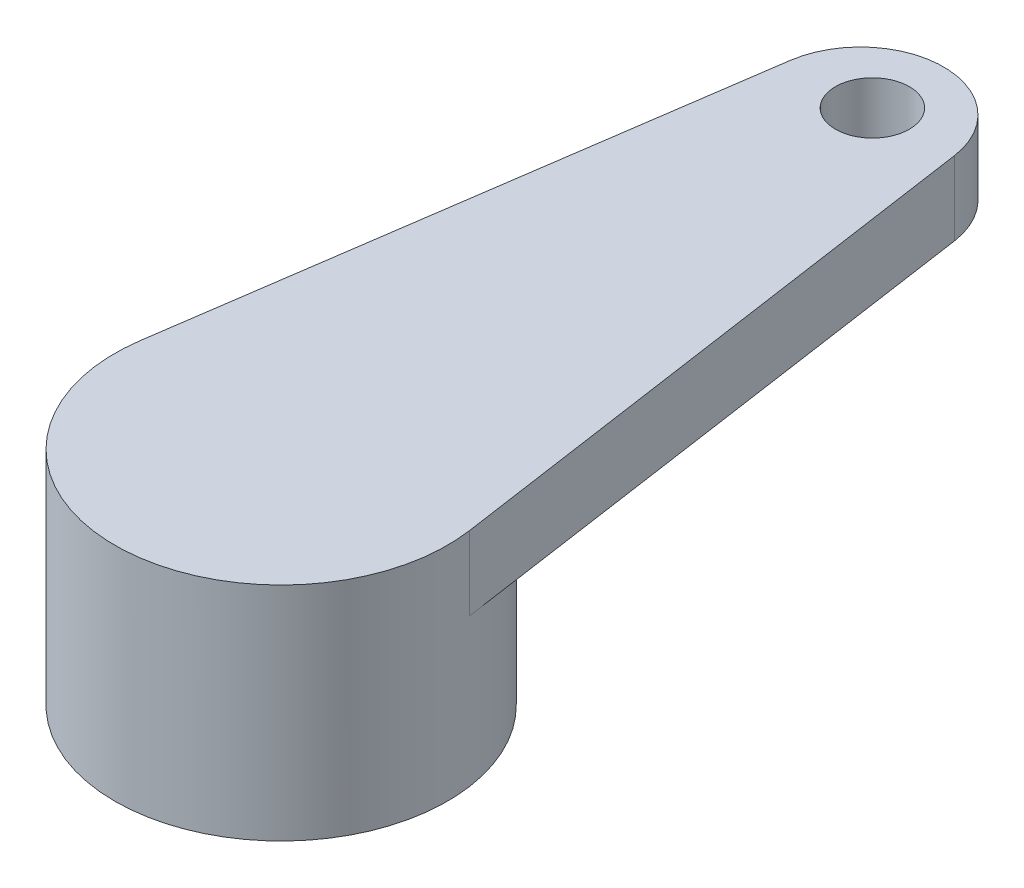
ISO-10303-21;
HEADER;
FILE_DESCRIPTION(('STEP AP214'),'2;1');
FILE_NAME('part.step','',(''),(''),'','','');
FILE_SCHEMA(('AUTOMOTIVE_DESIGN { 1 0 10303 214 1 1 1 1 }'));
ENDSEC;
DATA;
#1=APPLICATION_CONTEXT('core data for automotive mechanical design processes');
#2=APPLICATION_PROTOCOL_DEFINITION('international standard','automotive_design',2000,#1);
#3=PRODUCT_CONTEXT('',#1,'mechanical');
#4=PRODUCT('Part','Part','',(#3));
#5=PRODUCT_RELATED_PRODUCT_CATEGORY('part','',(#4));
#6=PRODUCT_DEFINITION_FORMATION('','',#4);
#7=PRODUCT_DEFINITION_CONTEXT('part definition',#1,'design');
#8=PRODUCT_DEFINITION('design','',#6,#7);
#9=PRODUCT_DEFINITION_SHAPE('','',#8);
#10=(LENGTH_UNIT() NAMED_UNIT(*) SI_UNIT(.MILLI.,.METRE.));
#11=(NAMED_UNIT(*) PLANE_ANGLE_UNIT() SI_UNIT($,.RADIAN.));
#12=(NAMED_UNIT(*) SI_UNIT($,.STERADIAN.) SOLID_ANGLE_UNIT());
#13=UNCERTAINTY_MEASURE_WITH_UNIT(LENGTH_MEASURE(1.E-05),#10,'distance_accuracy_value','');
#14=(GEOMETRIC_REPRESENTATION_CONTEXT(3) GLOBAL_UNCERTAINTY_ASSIGNED_CONTEXT((#13)) GLOBAL_UNIT_ASSIGNED_CONTEXT((#10,
#11,#12)) REPRESENTATION_CONTEXT('',''));
#15=CARTESIAN_POINT('',(0.,0.,0.));
#16=DIRECTION('',(0.,0.,1.));
#17=DIRECTION('',(1.,0.,0.));
#18=AXIS2_PLACEMENT_3D('',#15,#16,#17);
#19=CARTESIAN_POINT('',(0.,0.,0.));
#20=DIRECTION('',(0.,1.,0.));
#21=DIRECTION('',(0.,0.,1.));
#22=AXIS2_PLACEMENT_3D('',#19,#20,#21);
#23=PLANE('',#22);
#24=CARTESIAN_POINT('',(0.,0.,0.));
#25=DIRECTION('',(0.,1.,0.));
#26=DIRECTION('',(0.,0.,1.));
#27=AXIS2_PLACEMENT_3D('',#24,#25,#26);
#28=CIRCLE('',#27,4.5);
#29=CARTESIAN_POINT('',(0.,0.,4.5));
#30=VERTEX_POINT('',#29);
#31=EDGE_CURVE('E42',#30,#30,#28,.T.);
#32=ORIENTED_EDGE('',*,*,#31,.F.);
#33=EDGE_LOOP('',(#32));
#34=FACE_BOUND('',#33,.T.);
#35=CARTESIAN_POINT('',(0.,0.,0.));
#36=DIRECTION('',(0.,1.,0.));
#37=DIRECTION('',(0.,0.,1.));
#38=AXIS2_PLACEMENT_3D('',#35,#36,#37);
#39=CIRCLE('',#38,3.);
#40=CARTESIAN_POINT('',(0.,0.,3.));
#41=VERTEX_POINT('',#40);
#42=EDGE_CURVE('E109',#41,#41,#39,.T.);
#43=ORIENTED_EDGE('',*,*,#42,.T.);
#44=EDGE_LOOP('',(#43));
#45=FACE_BOUND('',#44,.T.);
#46=ADVANCED_FACE('F33',(#34,#45),#23,.F.);
#47=CARTESIAN_POINT('',(0.,4.,0.));
#48=DIRECTION('',(0.,-1.,0.));
#49=DIRECTION('',(0.,0.,-1.));
#50=AXIS2_PLACEMENT_3D('',#47,#48,#49);
#51=CYLINDRICAL_SURFACE('',#50,4.5);
#52=CARTESIAN_POINT('',(0.,4.,0.));
#53=DIRECTION('',(0.,1.,0.));
#54=DIRECTION('',(0.,0.,1.));
#55=AXIS2_PLACEMENT_3D('',#52,#53,#54);
#56=CIRCLE('',#55,4.5);
#57=CARTESIAN_POINT('',(4.45341229273585,4.,-0.645847467215914));
#58=VERTEX_POINT('',#57);
#59=CARTESIAN_POINT('',(-4.45341229273585,4.,-0.645847467215914));
#60=VERTEX_POINT('',#59);
#61=EDGE_CURVE('E11',#58,#60,#56,.T.);
#62=ORIENTED_EDGE('',*,*,#61,.F.);
#63=DIRECTION('',(0.,-1.,0.));
#64=VECTOR('',#63,1.);
#65=CARTESIAN_POINT('',(4.45341229273585,6.,-0.645847467215914));
#66=LINE('',#65,#64);
#67=CARTESIAN_POINT('',(4.45341229273585,6.,-0.645847467215914));
#68=VERTEX_POINT('',#67);
#69=EDGE_CURVE('E94',#68,#58,#66,.T.);
#70=ORIENTED_EDGE('',*,*,#69,.F.);
#71=CARTESIAN_POINT('',(0.,6.,0.));
#72=DIRECTION('',(0.,1.,0.));
#73=DIRECTION('',(0.,0.,1.));
#74=AXIS2_PLACEMENT_3D('',#71,#72,#73);
#75=CIRCLE('',#74,4.5);
#76=CARTESIAN_POINT('',(-4.45341229273585,6.,-0.645847467215913));
#77=VERTEX_POINT('',#76);
#78=EDGE_CURVE('E88',#77,#68,#75,.T.);
#79=ORIENTED_EDGE('',*,*,#78,.F.);
#80=DIRECTION('',(0.,-1.,0.));
#81=VECTOR('',#80,1.);
#82=CARTESIAN_POINT('',(-4.45341229273585,6.,-0.645847467215913));
#83=LINE('',#82,#81);
#84=EDGE_CURVE('E99',#77,#60,#83,.T.);
#85=ORIENTED_EDGE('',*,*,#84,.T.);
#86=EDGE_LOOP('',(#62,#70,#79,#85));
#87=FACE_BOUND('',#86,.T.);
#88=ORIENTED_EDGE('',*,*,#31,.T.);
#89=EDGE_LOOP('',(#88));
#90=FACE_BOUND('',#89,.T.);
#91=ADVANCED_FACE('F35',(#87,#90),#51,.T.);
#92=CARTESIAN_POINT('',(0.,4.,0.));
#93=DIRECTION('',(0.,-1.,0.));
#94=DIRECTION('',(0.,0.,-1.));
#95=AXIS2_PLACEMENT_3D('',#92,#93,#94);
#96=CYLINDRICAL_SURFACE('',#95,3.);
#97=CARTESIAN_POINT('',(0.,4.,0.));
#98=DIRECTION('',(0.,1.,0.));
#99=DIRECTION('',(0.,0.,1.));
#100=AXIS2_PLACEMENT_3D('',#97,#98,#99);
#101=CIRCLE('',#100,3.);
#102=CARTESIAN_POINT('',(0.,4.,3.));
#103=VERTEX_POINT('',#102);
#104=EDGE_CURVE('E106',#103,#103,#101,.T.);
#105=ORIENTED_EDGE('',*,*,#104,.T.);
#106=EDGE_LOOP('',(#105));
#107=FACE_BOUND('',#106,.T.);
#108=ORIENTED_EDGE('',*,*,#42,.F.);
#109=EDGE_LOOP('',(#108));
#110=FACE_BOUND('',#109,.T.);
#111=ADVANCED_FACE('F140',(#107,#110),#96,.F.);
#112=CARTESIAN_POINT('',(0.,4.,0.));
#113=DIRECTION('',(0.,1.,0.));
#114=DIRECTION('',(0.,0.,1.));
#115=AXIS2_PLACEMENT_3D('',#112,#113,#114);
#116=PLANE('',#115);
#117=ORIENTED_EDGE('',*,*,#104,.F.);
#118=EDGE_LOOP('',(#117));
#119=FACE_BOUND('',#118,.T.);
#120=ADVANCED_FACE('F132',(#119),#116,.F.);
#121=CARTESIAN_POINT('',(0.,4.,-16.));
#122=DIRECTION('',(0.,1.,0.));
#123=DIRECTION('',(0.,0.,1.));
#124=AXIS2_PLACEMENT_3D('',#121,#122,#123);
#125=CIRCLE('',#124,1.);
#126=CARTESIAN_POINT('',(0.,4.,-15.));
#127=VERTEX_POINT('',#126);
#128=EDGE_CURVE('E171',#127,#127,#125,.T.);
#129=ORIENTED_EDGE('',*,*,#128,.T.);
#130=EDGE_LOOP('',(#129));
#131=FACE_BOUND('',#130,.T.);
#132=DIRECTION('',(-0.143521659381314,0.,-0.989647176163522));
#133=VECTOR('',#132,1.);
#134=CARTESIAN_POINT('',(4.45341229273585,4.,-0.645847467215914));
#135=LINE('',#134,#133);
#136=CARTESIAN_POINT('',(2.22670614636792,4.,-16.));
#137=VERTEX_POINT('',#136);
#138=EDGE_CURVE('E93',#58,#137,#135,.T.);
#139=ORIENTED_EDGE('',*,*,#138,.F.);
#140=ORIENTED_EDGE('',*,*,#61,.T.);
#141=DIRECTION('',(-0.143521659381314,0.,0.989647176163522));
#142=VECTOR('',#141,1.);
#143=CARTESIAN_POINT('',(-4.45341229273585,4.,-0.645847467215913));
#144=LINE('',#143,#142);
#145=CARTESIAN_POINT('',(-2.22670614636793,4.,-16.));
#146=VERTEX_POINT('',#145);
#147=EDGE_CURVE('E104',#146,#60,#144,.T.);
#148=ORIENTED_EDGE('',*,*,#147,.F.);
#149=CARTESIAN_POINT('',(0.,4.,-15.677076266392));
#150=DIRECTION('',(0.,1.,0.));
#151=DIRECTION('',(0.,0.,-1.));
#152=AXIS2_PLACEMENT_3D('',#149,#150,#151);
#153=CIRCLE('',#152,2.25);
#154=EDGE_CURVE('E74',#137,#146,#153,.T.);
#155=ORIENTED_EDGE('',*,*,#154,.F.);
#156=EDGE_LOOP('',(#139,#140,#148,#155));
#157=FACE_BOUND('',#156,.T.);
#158=ADVANCED_FACE('F130',(#131,#157),#116,.F.);
#159=CARTESIAN_POINT('',(0.,6.,0.));
#160=DIRECTION('',(0.,1.,0.));
#161=DIRECTION('',(0.,0.,1.));
#162=AXIS2_PLACEMENT_3D('',#159,#160,#161);
#163=PLANE('',#162);
#164=ORIENTED_EDGE('',*,*,#78,.T.);
#165=DIRECTION('',(-0.143521659381314,0.,-0.989647176163522));
#166=VECTOR('',#165,1.);
#167=CARTESIAN_POINT('',(4.45341229273585,6.,-0.645847467215914));
#168=LINE('',#167,#166);
#169=CARTESIAN_POINT('',(2.22670614636792,6.,-16.));
#170=VERTEX_POINT('',#169);
#171=EDGE_CURVE('E82',#68,#170,#168,.T.);
#172=ORIENTED_EDGE('',*,*,#171,.T.);
#173=CARTESIAN_POINT('',(0.,6.,-15.677076266392));
#174=DIRECTION('',(0.,1.,0.));
#175=DIRECTION('',(0.,0.,-1.));
#176=AXIS2_PLACEMENT_3D('',#173,#174,#175);
#177=CIRCLE('',#176,2.25);
#178=CARTESIAN_POINT('',(-2.22670614636793,6.,-16.));
#179=VERTEX_POINT('',#178);
#180=EDGE_CURVE('E86',#170,#179,#177,.T.);
#181=ORIENTED_EDGE('',*,*,#180,.T.);
#182=DIRECTION('',(-0.143521659381314,0.,0.989647176163522));
#183=VECTOR('',#182,1.);
#184=CARTESIAN_POINT('',(-4.45341229273585,6.,-0.645847467215913));
#185=LINE('',#184,#183);
#186=EDGE_CURVE('E57',#179,#77,#185,.T.);
#187=ORIENTED_EDGE('',*,*,#186,.T.);
#188=EDGE_LOOP('',(#164,#172,#181,#187));
#189=FACE_BOUND('',#188,.T.);
#190=CARTESIAN_POINT('',(0.,6.,-16.));
#191=DIRECTION('',(0.,1.,0.));
#192=DIRECTION('',(0.,0.,1.));
#193=AXIS2_PLACEMENT_3D('',#190,#191,#192);
#194=CIRCLE('',#193,1.);
#195=CARTESIAN_POINT('',(0.,6.,-15.));
#196=VERTEX_POINT('',#195);
#197=EDGE_CURVE('E117',#196,#196,#194,.T.);
#198=ORIENTED_EDGE('',*,*,#197,.F.);
#199=EDGE_LOOP('',(#198));
#200=FACE_BOUND('',#199,.T.);
#201=ADVANCED_FACE('F83',(#189,#200),#163,.T.);
#202=CARTESIAN_POINT('',(4.45341229273585,6.,-0.645847467215914));
#203=DIRECTION('',(-0.989647176163522,0.,0.143521659381314));
#204=DIRECTION('',(0.143521659381314,0.,0.989647176163522));
#205=AXIS2_PLACEMENT_3D('',#202,#203,#204);
#206=PLANE('',#205);
#207=ORIENTED_EDGE('',*,*,#138,.T.);
#208=DIRECTION('',(0.,-1.,0.));
#209=VECTOR('',#208,1.);
#210=CARTESIAN_POINT('',(2.22670614636792,6.,-16.));
#211=LINE('',#210,#209);
#212=EDGE_CURVE('E91',#170,#137,#211,.T.);
#213=ORIENTED_EDGE('',*,*,#212,.F.);
#214=ORIENTED_EDGE('',*,*,#171,.F.);
#215=ORIENTED_EDGE('',*,*,#69,.T.);
#216=EDGE_LOOP('',(#207,#213,#214,#215));
#217=FACE_BOUND('',#216,.T.);
#218=ADVANCED_FACE('F92',(#217),#206,.F.);
#219=CARTESIAN_POINT('',(0.,6.,-15.677076266392));
#220=DIRECTION('',(0.,-1.,0.));
#221=DIRECTION('',(0.,0.,-1.));
#222=AXIS2_PLACEMENT_3D('',#219,#220,#221);
#223=CYLINDRICAL_SURFACE('',#222,2.25);
#224=ORIENTED_EDGE('',*,*,#154,.T.);
#225=DIRECTION('',(0.,-1.,0.));
#226=VECTOR('',#225,1.);
#227=CARTESIAN_POINT('',(-2.22670614636793,6.,-16.));
#228=LINE('',#227,#226);
#229=EDGE_CURVE('E95',#179,#146,#228,.T.);
#230=ORIENTED_EDGE('',*,*,#229,.F.);
#231=ORIENTED_EDGE('',*,*,#180,.F.);
#232=ORIENTED_EDGE('',*,*,#212,.T.);
#233=EDGE_LOOP('',(#224,#230,#231,#232));
#234=FACE_BOUND('',#233,.T.);
#235=ADVANCED_FACE('F97',(#234),#223,.T.);
#236=CARTESIAN_POINT('',(-4.45341229273585,6.,-0.645847467215913));
#237=DIRECTION('',(0.989647176163522,0.,0.143521659381314));
#238=DIRECTION('',(0.143521659381314,0.,-0.989647176163522));
#239=AXIS2_PLACEMENT_3D('',#236,#237,#238);
#240=PLANE('',#239);
#241=ORIENTED_EDGE('',*,*,#147,.T.);
#242=ORIENTED_EDGE('',*,*,#84,.F.);
#243=ORIENTED_EDGE('',*,*,#186,.F.);
#244=ORIENTED_EDGE('',*,*,#229,.T.);
#245=EDGE_LOOP('',(#241,#242,#243,#244));
#246=FACE_BOUND('',#245,.T.);
#247=ADVANCED_FACE('F129',(#246),#240,.F.);
#248=CARTESIAN_POINT('',(0.,6.,-16.));
#249=DIRECTION('',(0.,-1.,0.));
#250=DIRECTION('',(0.,0.,-1.));
#251=AXIS2_PLACEMENT_3D('',#248,#249,#250);
#252=CYLINDRICAL_SURFACE('',#251,1.);
#253=ORIENTED_EDGE('',*,*,#197,.T.);
#254=EDGE_LOOP('',(#253));
#255=FACE_BOUND('',#254,.T.);
#256=ORIENTED_EDGE('',*,*,#128,.F.);
#257=EDGE_LOOP('',(#256));
#258=FACE_BOUND('',#257,.T.);
#259=ADVANCED_FACE('F159',(#255,#258),#252,.F.);
#260=CLOSED_SHELL('',(#46,#91,#111,#120,#158,#201,#218,#235,#247,#259));
#261=MANIFOLD_SOLID_BREP('B2',#260);
#262=ADVANCED_BREP_SHAPE_REPRESENTATION('',(#18,#261),#14);
#263=SHAPE_DEFINITION_REPRESENTATION(#9,#262);
ENDSEC;
END-ISO-10303-21;
